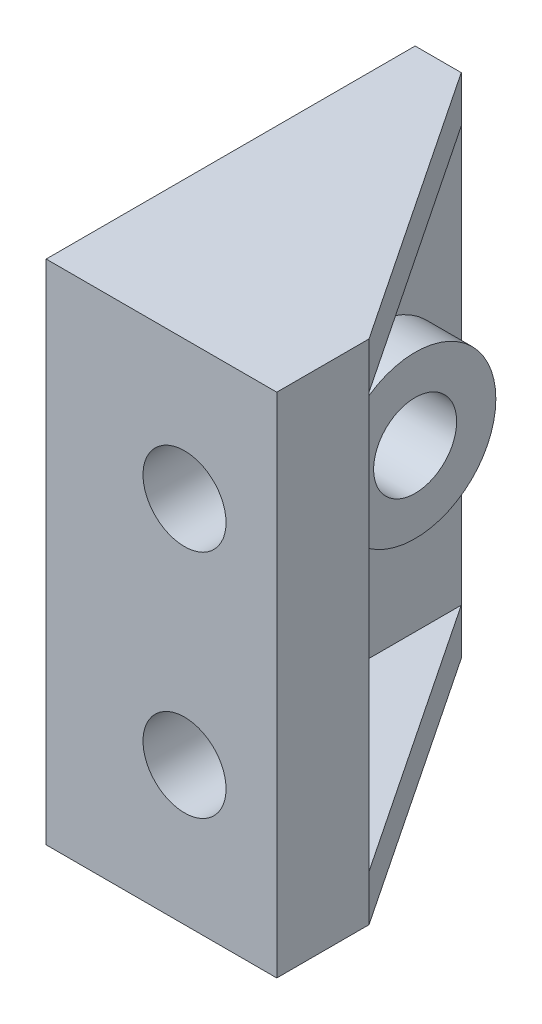
ISO-10303-21;
HEADER;
FILE_DESCRIPTION(('STEP AP214'),'2;1');
FILE_NAME('part.step','',(''),(''),'','','');
FILE_SCHEMA(('AUTOMOTIVE_DESIGN { 1 0 10303 214 1 1 1 1 }'));
ENDSEC;
DATA;
#1=APPLICATION_CONTEXT('core data for automotive mechanical design processes');
#2=APPLICATION_PROTOCOL_DEFINITION('international standard','automotive_design',2000,#1);
#3=PRODUCT_CONTEXT('',#1,'mechanical');
#4=PRODUCT('Part','Part','',(#3));
#5=PRODUCT_RELATED_PRODUCT_CATEGORY('part','',(#4));
#6=PRODUCT_DEFINITION_FORMATION('','',#4);
#7=PRODUCT_DEFINITION_CONTEXT('part definition',#1,'design');
#8=PRODUCT_DEFINITION('design','',#6,#7);
#9=PRODUCT_DEFINITION_SHAPE('','',#8);
#10=(LENGTH_UNIT() NAMED_UNIT(*) SI_UNIT(.MILLI.,.METRE.));
#11=(NAMED_UNIT(*) PLANE_ANGLE_UNIT() SI_UNIT($,.RADIAN.));
#12=(NAMED_UNIT(*) SI_UNIT($,.STERADIAN.) SOLID_ANGLE_UNIT());
#13=UNCERTAINTY_MEASURE_WITH_UNIT(LENGTH_MEASURE(1.E-05),#10,'distance_accuracy_value','');
#14=(GEOMETRIC_REPRESENTATION_CONTEXT(3) GLOBAL_UNCERTAINTY_ASSIGNED_CONTEXT((#13)) GLOBAL_UNIT_ASSIGNED_CONTEXT((#10,
#11,#12)) REPRESENTATION_CONTEXT('',''));
#15=CARTESIAN_POINT('',(0.,0.,0.));
#16=DIRECTION('',(0.,0.,1.));
#17=DIRECTION('',(1.,0.,0.));
#18=AXIS2_PLACEMENT_3D('',#15,#16,#17);
#19=CARTESIAN_POINT('',(5.,5.,30.));
#20=DIRECTION('',(1.,0.,0.));
#21=DIRECTION('',(0.,0.,-1.));
#22=AXIS2_PLACEMENT_3D('',#19,#20,#21);
#23=PLANE('',#22);
#24=DIRECTION('',(0.,-1.,0.));
#25=VECTOR('',#24,1.);
#26=CARTESIAN_POINT('',(5.,50.,30.));
#27=LINE('',#26,#25);
#28=CARTESIAN_POINT('',(5.,50.,30.));
#29=VERTEX_POINT('',#28);
#30=CARTESIAN_POINT('',(5.,5.,30.));
#31=VERTEX_POINT('',#30);
#32=EDGE_CURVE('E169',#29,#31,#27,.T.);
#33=ORIENTED_EDGE('',*,*,#32,.T.);
#34=DIRECTION('',(0.,0.,-1.));
#35=VECTOR('',#34,1.);
#36=CARTESIAN_POINT('',(5.,5.,30.));
#37=LINE('',#36,#35);
#38=CARTESIAN_POINT('',(5.,5.,0.));
#39=VERTEX_POINT('',#38);
#40=EDGE_CURVE('E165',#31,#39,#37,.T.);
#41=ORIENTED_EDGE('',*,*,#40,.T.);
#42=DIRECTION('',(0.,1.,0.));
#43=VECTOR('',#42,1.);
#44=CARTESIAN_POINT('',(5.,50.,0.));
#45=LINE('',#44,#43);
#46=CARTESIAN_POINT('',(5.,50.,0.));
#47=VERTEX_POINT('',#46);
#48=EDGE_CURVE('E157',#39,#47,#45,.T.);
#49=ORIENTED_EDGE('',*,*,#48,.T.);
#50=DIRECTION('',(0.,0.,1.));
#51=VECTOR('',#50,1.);
#52=CARTESIAN_POINT('',(5.,50.,30.));
#53=LINE('',#52,#51);
#54=EDGE_CURVE('E164',#47,#29,#53,.T.);
#55=ORIENTED_EDGE('',*,*,#54,.T.);
#56=EDGE_LOOP('',(#33,#41,#49,#55));
#57=FACE_BOUND('',#56,.T.);
#58=CARTESIAN_POINT('',(5.,27.5,9.99999999999999));
#59=DIRECTION('',(1.,0.,0.));
#60=DIRECTION('',(0.,0.,-1.));
#61=AXIS2_PLACEMENT_3D('',#58,#59,#60);
#62=CIRCLE('',#61,8.75);
#63=CARTESIAN_POINT('',(5.,27.5,1.24999999999999));
#64=VERTEX_POINT('',#63);
#65=EDGE_CURVE('E233',#64,#64,#62,.T.);
#66=ORIENTED_EDGE('',*,*,#65,.F.);
#67=EDGE_LOOP('',(#66));
#68=FACE_BOUND('',#67,.T.);
#69=ADVANCED_FACE('F30',(#57,#68),#23,.T.);
#70=CARTESIAN_POINT('',(25.,55.,30.));
#71=DIRECTION('',(-0.832050294337844,0.,0.554700196225229));
#72=DIRECTION('',(0.554700196225229,0.,0.832050294337844));
#73=AXIS2_PLACEMENT_3D('',#70,#71,#72);
#74=PLANE('',#73);
#75=DIRECTION('',(0.,-1.,0.));
#76=VECTOR('',#75,1.);
#77=CARTESIAN_POINT('',(25.,55.,30.));
#78=LINE('',#77,#76);
#79=CARTESIAN_POINT('',(25.,55.,30.));
#80=VERTEX_POINT('',#79);
#81=CARTESIAN_POINT('',(25.,50.,30.));
#82=VERTEX_POINT('',#81);
#83=EDGE_CURVE('E130',#80,#82,#78,.T.);
#84=ORIENTED_EDGE('',*,*,#83,.T.);
#85=DIRECTION('',(-0.554700196225229,0.,-0.832050294337844));
#86=VECTOR('',#85,1.);
#87=CARTESIAN_POINT('',(25.,50.,30.));
#88=LINE('',#87,#86);
#89=EDGE_CURVE('E11',#82,#47,#88,.T.);
#90=ORIENTED_EDGE('',*,*,#89,.T.);
#91=DIRECTION('',(0.,-1.,0.));
#92=VECTOR('',#91,1.);
#93=CARTESIAN_POINT('',(5.,55.,0.));
#94=LINE('',#93,#92);
#95=CARTESIAN_POINT('',(5.,55.,0.));
#96=VERTEX_POINT('',#95);
#97=EDGE_CURVE('E136',#96,#47,#94,.T.);
#98=ORIENTED_EDGE('',*,*,#97,.F.);
#99=DIRECTION('',(-0.554700196225229,0.,-0.832050294337843));
#100=VECTOR('',#99,1.);
#101=CARTESIAN_POINT('',(25.,55.,30.));
#102=LINE('',#101,#100);
#103=EDGE_CURVE('E129',#80,#96,#102,.T.);
#104=ORIENTED_EDGE('',*,*,#103,.F.);
#105=EDGE_LOOP('',(#84,#90,#98,#104));
#106=FACE_BOUND('',#105,.T.);
#107=ADVANCED_FACE('F179',(#106),#74,.F.);
#108=CARTESIAN_POINT('',(5.,0.,0.));
#109=VERTEX_POINT('',#108);
#110=EDGE_CURVE('E135',#39,#109,#94,.T.);
#111=ORIENTED_EDGE('',*,*,#110,.F.);
#112=DIRECTION('',(0.554700196225229,0.,0.832050294337844));
#113=VECTOR('',#112,1.);
#114=CARTESIAN_POINT('',(25.,5.,30.));
#115=LINE('',#114,#113);
#116=CARTESIAN_POINT('',(25.,5.,30.));
#117=VERTEX_POINT('',#116);
#118=EDGE_CURVE('E38',#39,#117,#115,.T.);
#119=ORIENTED_EDGE('',*,*,#118,.T.);
#120=CARTESIAN_POINT('',(25.,0.,30.));
#121=VERTEX_POINT('',#120);
#122=EDGE_CURVE('E79',#117,#121,#78,.T.);
#123=ORIENTED_EDGE('',*,*,#122,.T.);
#124=DIRECTION('',(-0.554700196225229,0.,-0.832050294337843));
#125=VECTOR('',#124,1.);
#126=CARTESIAN_POINT('',(25.,0.,30.));
#127=LINE('',#126,#125);
#128=EDGE_CURVE('E120',#121,#109,#127,.T.);
#129=ORIENTED_EDGE('',*,*,#128,.T.);
#130=EDGE_LOOP('',(#111,#119,#123,#129));
#131=FACE_BOUND('',#130,.T.);
#132=ADVANCED_FACE('F32',(#131),#74,.F.);
#133=CARTESIAN_POINT('',(5.,55.,0.));
#134=DIRECTION('',(0.,0.,1.));
#135=DIRECTION('',(1.,0.,0.));
#136=AXIS2_PLACEMENT_3D('',#133,#134,#135);
#137=PLANE('',#136);
#138=DIRECTION('',(-1.,0.,0.));
#139=VECTOR('',#138,1.);
#140=CARTESIAN_POINT('',(5.,0.,0.));
#141=LINE('',#140,#139);
#142=CARTESIAN_POINT('',(0.,0.,0.));
#143=VERTEX_POINT('',#142);
#144=EDGE_CURVE('E122',#109,#143,#141,.T.);
#145=ORIENTED_EDGE('',*,*,#144,.T.);
#146=DIRECTION('',(0.,-1.,0.));
#147=VECTOR('',#146,1.);
#148=CARTESIAN_POINT('',(0.,55.,0.));
#149=LINE('',#148,#147);
#150=CARTESIAN_POINT('',(0.,55.,0.));
#151=VERTEX_POINT('',#150);
#152=EDGE_CURVE('E111',#151,#143,#149,.T.);
#153=ORIENTED_EDGE('',*,*,#152,.F.);
#154=DIRECTION('',(-1.,0.,0.));
#155=VECTOR('',#154,1.);
#156=CARTESIAN_POINT('',(5.,55.,0.));
#157=LINE('',#156,#155);
#158=EDGE_CURVE('E88',#96,#151,#157,.T.);
#159=ORIENTED_EDGE('',*,*,#158,.F.);
#160=ORIENTED_EDGE('',*,*,#97,.T.);
#161=ORIENTED_EDGE('',*,*,#48,.F.);
#162=ORIENTED_EDGE('',*,*,#110,.T.);
#163=EDGE_LOOP('',(#145,#153,#159,#160,#161,#162));
#164=FACE_BOUND('',#163,.T.);
#165=ADVANCED_FACE('F155',(#164),#137,.F.);
#166=CARTESIAN_POINT('',(0.,55.,0.));
#167=DIRECTION('',(1.,0.,0.));
#168=DIRECTION('',(0.,0.,-1.));
#169=AXIS2_PLACEMENT_3D('',#166,#167,#168);
#170=PLANE('',#169);
#171=CARTESIAN_POINT('',(0.,27.5,9.99999999999999));
#172=DIRECTION('',(1.,0.,0.));
#173=DIRECTION('',(0.,0.,-1.));
#174=AXIS2_PLACEMENT_3D('',#171,#172,#173);
#175=CIRCLE('',#174,4.5);
#176=CARTESIAN_POINT('',(0.,27.5,5.49999999999999));
#177=VERTEX_POINT('',#176);
#178=EDGE_CURVE('E231',#177,#177,#175,.F.);
#179=ORIENTED_EDGE('',*,*,#178,.F.);
#180=EDGE_LOOP('',(#179));
#181=FACE_BOUND('',#180,.T.);
#182=DIRECTION('',(0.,0.,1.));
#183=VECTOR('',#182,1.);
#184=CARTESIAN_POINT('',(0.,0.,0.));
#185=LINE('',#184,#183);
#186=CARTESIAN_POINT('',(0.,0.,40.));
#187=VERTEX_POINT('',#186);
#188=EDGE_CURVE('E108',#143,#187,#185,.T.);
#189=ORIENTED_EDGE('',*,*,#188,.T.);
#190=DIRECTION('',(0.,-1.,0.));
#191=VECTOR('',#190,1.);
#192=CARTESIAN_POINT('',(0.,55.,40.));
#193=LINE('',#192,#191);
#194=CARTESIAN_POINT('',(0.,55.,40.));
#195=VERTEX_POINT('',#194);
#196=EDGE_CURVE('E105',#195,#187,#193,.T.);
#197=ORIENTED_EDGE('',*,*,#196,.F.);
#198=DIRECTION('',(0.,0.,1.));
#199=VECTOR('',#198,1.);
#200=CARTESIAN_POINT('',(0.,55.,0.));
#201=LINE('',#200,#199);
#202=EDGE_CURVE('E95',#151,#195,#201,.T.);
#203=ORIENTED_EDGE('',*,*,#202,.F.);
#204=ORIENTED_EDGE('',*,*,#152,.T.);
#205=EDGE_LOOP('',(#189,#197,#203,#204));
#206=FACE_BOUND('',#205,.T.);
#207=ADVANCED_FACE('F106',(#181,#206),#170,.F.);
#208=CARTESIAN_POINT('',(0.,55.,40.));
#209=DIRECTION('',(0.,0.,-1.));
#210=DIRECTION('',(-1.,0.,0.));
#211=AXIS2_PLACEMENT_3D('',#208,#209,#210);
#212=PLANE('',#211);
#213=CARTESIAN_POINT('',(15.,15.,40.));
#214=DIRECTION('',(0.,0.,1.));
#215=DIRECTION('',(1.,0.,0.));
#216=AXIS2_PLACEMENT_3D('',#213,#214,#215);
#217=CIRCLE('',#216,4.5);
#218=CARTESIAN_POINT('',(19.5,15.,40.));
#219=VERTEX_POINT('',#218);
#220=EDGE_CURVE('E241',#219,#219,#217,.T.);
#221=ORIENTED_EDGE('',*,*,#220,.F.);
#222=EDGE_LOOP('',(#221));
#223=FACE_BOUND('',#222,.T.);
#224=CARTESIAN_POINT('',(15.,40.,40.));
#225=DIRECTION('',(0.,0.,1.));
#226=DIRECTION('',(1.,0.,0.));
#227=AXIS2_PLACEMENT_3D('',#224,#225,#226);
#228=CIRCLE('',#227,4.50000000000001);
#229=CARTESIAN_POINT('',(19.5,40.,40.));
#230=VERTEX_POINT('',#229);
#231=EDGE_CURVE('E248',#230,#230,#228,.T.);
#232=ORIENTED_EDGE('',*,*,#231,.F.);
#233=EDGE_LOOP('',(#232));
#234=FACE_BOUND('',#233,.T.);
#235=DIRECTION('',(1.,0.,0.));
#236=VECTOR('',#235,1.);
#237=CARTESIAN_POINT('',(0.,0.,40.));
#238=LINE('',#237,#236);
#239=CARTESIAN_POINT('',(25.,0.,40.));
#240=VERTEX_POINT('',#239);
#241=EDGE_CURVE('E125',#187,#240,#238,.T.);
#242=ORIENTED_EDGE('',*,*,#241,.T.);
#243=DIRECTION('',(0.,-1.,0.));
#244=VECTOR('',#243,1.);
#245=CARTESIAN_POINT('',(25.,55.,40.));
#246=LINE('',#245,#244);
#247=CARTESIAN_POINT('',(25.,55.,40.));
#248=VERTEX_POINT('',#247);
#249=EDGE_CURVE('E112',#248,#240,#246,.T.);
#250=ORIENTED_EDGE('',*,*,#249,.F.);
#251=DIRECTION('',(1.,0.,0.));
#252=VECTOR('',#251,1.);
#253=CARTESIAN_POINT('',(0.,55.,40.));
#254=LINE('',#253,#252);
#255=EDGE_CURVE('E99',#195,#248,#254,.T.);
#256=ORIENTED_EDGE('',*,*,#255,.F.);
#257=ORIENTED_EDGE('',*,*,#196,.T.);
#258=EDGE_LOOP('',(#242,#250,#256,#257));
#259=FACE_BOUND('',#258,.T.);
#260=ADVANCED_FACE('F114',(#223,#234,#259),#212,.F.);
#261=CARTESIAN_POINT('',(25.,55.,40.));
#262=DIRECTION('',(-1.,0.,0.));
#263=DIRECTION('',(0.,0.,1.));
#264=AXIS2_PLACEMENT_3D('',#261,#262,#263);
#265=PLANE('',#264);
#266=DIRECTION('',(0.,0.,-1.));
#267=VECTOR('',#266,1.);
#268=CARTESIAN_POINT('',(25.,0.,40.));
#269=LINE('',#268,#267);
#270=EDGE_CURVE('E127',#240,#121,#269,.T.);
#271=ORIENTED_EDGE('',*,*,#270,.T.);
#272=ORIENTED_EDGE('',*,*,#122,.F.);
#273=DIRECTION('',(0.,-1.,0.));
#274=VECTOR('',#273,1.);
#275=CARTESIAN_POINT('',(25.,50.,30.));
#276=LINE('',#275,#274);
#277=EDGE_CURVE('E149',#82,#117,#276,.T.);
#278=ORIENTED_EDGE('',*,*,#277,.F.);
#279=ORIENTED_EDGE('',*,*,#83,.F.);
#280=DIRECTION('',(0.,0.,-1.));
#281=VECTOR('',#280,1.);
#282=CARTESIAN_POINT('',(25.,55.,40.));
#283=LINE('',#282,#281);
#284=EDGE_CURVE('E54',#248,#80,#283,.T.);
#285=ORIENTED_EDGE('',*,*,#284,.F.);
#286=ORIENTED_EDGE('',*,*,#249,.T.);
#287=EDGE_LOOP('',(#271,#272,#278,#279,#285,#286));
#288=FACE_BOUND('',#287,.T.);
#289=ADVANCED_FACE('F148',(#288),#265,.F.);
#290=CARTESIAN_POINT('',(5.,55.,0.));
#291=DIRECTION('',(0.,1.,0.));
#292=DIRECTION('',(0.,0.,1.));
#293=AXIS2_PLACEMENT_3D('',#290,#291,#292);
#294=PLANE('',#293);
#295=ORIENTED_EDGE('',*,*,#103,.T.);
#296=ORIENTED_EDGE('',*,*,#158,.T.);
#297=ORIENTED_EDGE('',*,*,#202,.T.);
#298=ORIENTED_EDGE('',*,*,#255,.T.);
#299=ORIENTED_EDGE('',*,*,#284,.T.);
#300=EDGE_LOOP('',(#295,#296,#297,#298,#299));
#301=FACE_BOUND('',#300,.T.);
#302=ADVANCED_FACE('F97',(#301),#294,.T.);
#303=CARTESIAN_POINT('',(5.,0.,0.));
#304=DIRECTION('',(0.,1.,0.));
#305=DIRECTION('',(0.,0.,1.));
#306=AXIS2_PLACEMENT_3D('',#303,#304,#305);
#307=PLANE('',#306);
#308=ORIENTED_EDGE('',*,*,#128,.F.);
#309=ORIENTED_EDGE('',*,*,#270,.F.);
#310=ORIENTED_EDGE('',*,*,#241,.F.);
#311=ORIENTED_EDGE('',*,*,#188,.F.);
#312=ORIENTED_EDGE('',*,*,#144,.F.);
#313=EDGE_LOOP('',(#308,#309,#310,#311,#312));
#314=FACE_BOUND('',#313,.T.);
#315=ADVANCED_FACE('F154',(#314),#307,.F.);
#316=CARTESIAN_POINT('',(5.,50.,30.));
#317=DIRECTION('',(0.,1.,0.));
#318=DIRECTION('',(0.,0.,1.));
#319=AXIS2_PLACEMENT_3D('',#316,#317,#318);
#320=PLANE('',#319);
#321=DIRECTION('',(1.,0.,0.));
#322=VECTOR('',#321,1.);
#323=CARTESIAN_POINT('',(5.,50.,30.));
#324=LINE('',#323,#322);
#325=EDGE_CURVE('E45',#29,#82,#324,.T.);
#326=ORIENTED_EDGE('',*,*,#325,.F.);
#327=ORIENTED_EDGE('',*,*,#54,.F.);
#328=ORIENTED_EDGE('',*,*,#89,.F.);
#329=EDGE_LOOP('',(#326,#327,#328));
#330=FACE_BOUND('',#329,.T.);
#331=ADVANCED_FACE('F182',(#330),#320,.F.);
#332=CARTESIAN_POINT('',(5.,5.,30.));
#333=DIRECTION('',(0.,-1.,0.));
#334=DIRECTION('',(0.,0.,-1.));
#335=AXIS2_PLACEMENT_3D('',#332,#333,#334);
#336=PLANE('',#335);
#337=ORIENTED_EDGE('',*,*,#40,.F.);
#338=DIRECTION('',(1.,0.,0.));
#339=VECTOR('',#338,1.);
#340=CARTESIAN_POINT('',(5.,5.,30.));
#341=LINE('',#340,#339);
#342=EDGE_CURVE('E167',#31,#117,#341,.T.);
#343=ORIENTED_EDGE('',*,*,#342,.T.);
#344=ORIENTED_EDGE('',*,*,#118,.F.);
#345=EDGE_LOOP('',(#337,#343,#344));
#346=FACE_BOUND('',#345,.T.);
#347=ADVANCED_FACE('F188',(#346),#336,.F.);
#348=CARTESIAN_POINT('',(5.,50.,30.));
#349=DIRECTION('',(0.,0.,1.));
#350=DIRECTION('',(0.,-1.,0.));
#351=AXIS2_PLACEMENT_3D('',#348,#349,#350);
#352=PLANE('',#351);
#353=CARTESIAN_POINT('',(15.,15.,30.));
#354=DIRECTION('',(0.,0.,1.));
#355=DIRECTION('',(0.,-1.,0.));
#356=AXIS2_PLACEMENT_3D('',#353,#354,#355);
#357=CIRCLE('',#356,4.5);
#358=CARTESIAN_POINT('',(15.,10.5,30.));
#359=VERTEX_POINT('',#358);
#360=EDGE_CURVE('E245',#359,#359,#357,.F.);
#361=ORIENTED_EDGE('',*,*,#360,.F.);
#362=EDGE_LOOP('',(#361));
#363=FACE_BOUND('',#362,.T.);
#364=CARTESIAN_POINT('',(15.,40.,30.));
#365=DIRECTION('',(0.,0.,1.));
#366=DIRECTION('',(0.,-1.,0.));
#367=AXIS2_PLACEMENT_3D('',#364,#365,#366);
#368=CIRCLE('',#367,4.50000000000001);
#369=CARTESIAN_POINT('',(15.,35.5,30.));
#370=VERTEX_POINT('',#369);
#371=EDGE_CURVE('E174',#370,#370,#368,.F.);
#372=ORIENTED_EDGE('',*,*,#371,.F.);
#373=EDGE_LOOP('',(#372));
#374=FACE_BOUND('',#373,.T.);
#375=ORIENTED_EDGE('',*,*,#277,.T.);
#376=ORIENTED_EDGE('',*,*,#342,.F.);
#377=ORIENTED_EDGE('',*,*,#32,.F.);
#378=ORIENTED_EDGE('',*,*,#325,.T.);
#379=EDGE_LOOP('',(#375,#376,#377,#378));
#380=FACE_BOUND('',#379,.T.);
#381=ADVANCED_FACE('F187',(#363,#374,#380),#352,.F.);
#382=CARTESIAN_POINT('',(15.,40.,-0.00100000000000794));
#383=DIRECTION('',(0.,0.,1.));
#384=DIRECTION('',(1.,0.,0.));
#385=AXIS2_PLACEMENT_3D('',#382,#383,#384);
#386=CYLINDRICAL_SURFACE('',#385,4.50000000000001);
#387=ORIENTED_EDGE('',*,*,#231,.T.);
#388=EDGE_LOOP('',(#387));
#389=FACE_BOUND('',#388,.T.);
#390=ORIENTED_EDGE('',*,*,#371,.T.);
#391=EDGE_LOOP('',(#390));
#392=FACE_BOUND('',#391,.T.);
#393=ADVANCED_FACE('F195',(#389,#392),#386,.F.);
#394=CARTESIAN_POINT('',(15.,15.,-0.00100000000000794));
#395=DIRECTION('',(0.,0.,1.));
#396=DIRECTION('',(1.,0.,0.));
#397=AXIS2_PLACEMENT_3D('',#394,#395,#396);
#398=CYLINDRICAL_SURFACE('',#397,4.5);
#399=ORIENTED_EDGE('',*,*,#220,.T.);
#400=EDGE_LOOP('',(#399));
#401=FACE_BOUND('',#400,.T.);
#402=ORIENTED_EDGE('',*,*,#360,.T.);
#403=EDGE_LOOP('',(#402));
#404=FACE_BOUND('',#403,.T.);
#405=ADVANCED_FACE('F207',(#401,#404),#398,.F.);
#406=CARTESIAN_POINT('',(10.,27.5,9.99999999999999));
#407=DIRECTION('',(-1.,0.,0.));
#408=DIRECTION('',(0.,0.,1.));
#409=AXIS2_PLACEMENT_3D('',#406,#407,#408);
#410=CYLINDRICAL_SURFACE('',#409,8.75);
#411=CARTESIAN_POINT('',(10.,27.5,9.99999999999999));
#412=DIRECTION('',(1.,0.,0.));
#413=DIRECTION('',(0.,0.,-1.));
#414=AXIS2_PLACEMENT_3D('',#411,#412,#413);
#415=CIRCLE('',#414,8.75);
#416=CARTESIAN_POINT('',(10.,27.5,1.24999999999999));
#417=VERTEX_POINT('',#416);
#418=EDGE_CURVE('E236',#417,#417,#415,.T.);
#419=ORIENTED_EDGE('',*,*,#418,.F.);
#420=EDGE_LOOP('',(#419));
#421=FACE_BOUND('',#420,.T.);
#422=ORIENTED_EDGE('',*,*,#65,.T.);
#423=EDGE_LOOP('',(#422));
#424=FACE_BOUND('',#423,.T.);
#425=ADVANCED_FACE('F211',(#421,#424),#410,.T.);
#426=CARTESIAN_POINT('',(10.,27.5,9.99999999999999));
#427=DIRECTION('',(1.,0.,0.));
#428=DIRECTION('',(0.,0.,-1.));
#429=AXIS2_PLACEMENT_3D('',#426,#427,#428);
#430=PLANE('',#429);
#431=CARTESIAN_POINT('',(10.,27.5,9.99999999999999));
#432=DIRECTION('',(1.,0.,0.));
#433=DIRECTION('',(0.,0.,-1.));
#434=AXIS2_PLACEMENT_3D('',#431,#432,#433);
#435=CIRCLE('',#434,4.5);
#436=CARTESIAN_POINT('',(10.,27.5,5.49999999999999));
#437=VERTEX_POINT('',#436);
#438=EDGE_CURVE('E228',#437,#437,#435,.T.);
#439=ORIENTED_EDGE('',*,*,#438,.F.);
#440=EDGE_LOOP('',(#439));
#441=FACE_BOUND('',#440,.T.);
#442=ORIENTED_EDGE('',*,*,#418,.T.);
#443=EDGE_LOOP('',(#442));
#444=FACE_BOUND('',#443,.T.);
#445=ADVANCED_FACE('F215',(#441,#444),#430,.T.);
#446=CARTESIAN_POINT('',(-0.000999999999999265,27.5,9.99999999999999));
#447=DIRECTION('',(1.,0.,0.));
#448=DIRECTION('',(0.,0.,-1.));
#449=AXIS2_PLACEMENT_3D('',#446,#447,#448);
#450=CYLINDRICAL_SURFACE('',#449,4.5);
#451=ORIENTED_EDGE('',*,*,#438,.T.);
#452=EDGE_LOOP('',(#451));
#453=FACE_BOUND('',#452,.T.);
#454=ORIENTED_EDGE('',*,*,#178,.T.);
#455=EDGE_LOOP('',(#454));
#456=FACE_BOUND('',#455,.T.);
#457=ADVANCED_FACE('F219',(#453,#456),#450,.F.);
#458=CLOSED_SHELL('',(#69,#107,#132,#165,#207,#260,#289,#302,#315,#331,#347,#381,#393,#405,#425,
#445,#457));
#459=MANIFOLD_SOLID_BREP('B2',#458);
#460=ADVANCED_BREP_SHAPE_REPRESENTATION('',(#18,#459),#14);
#461=SHAPE_DEFINITION_REPRESENTATION(#9,#460);
ENDSEC;
END-ISO-10303-21;
